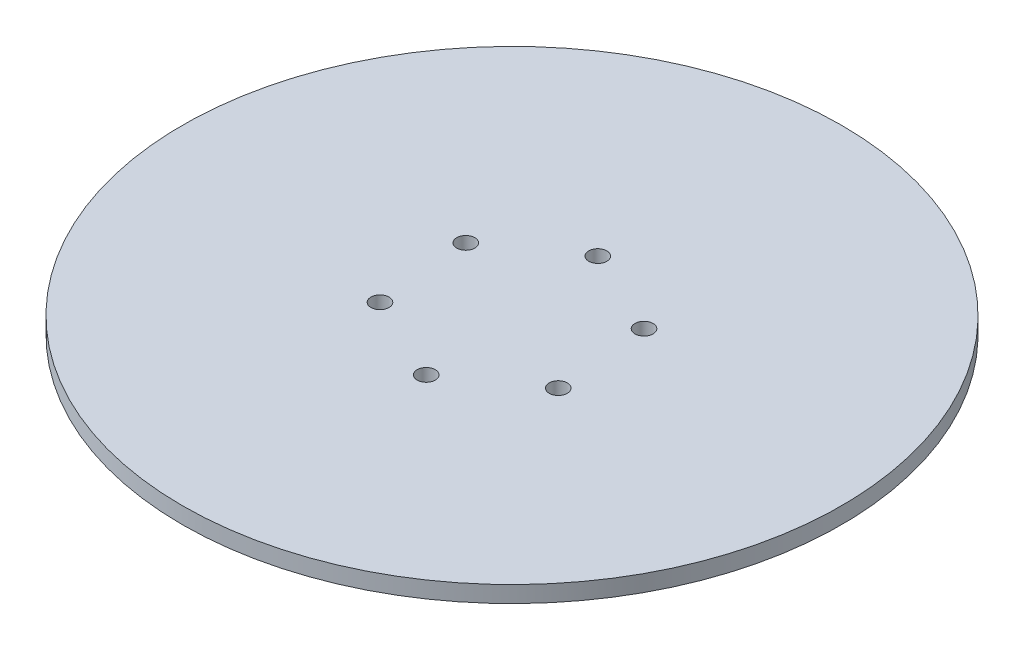
ISO-10303-21;
HEADER;
FILE_DESCRIPTION(('STEP AP214'),'2;1');
FILE_NAME('part.step','',(''),(''),'','','');
FILE_SCHEMA(('AUTOMOTIVE_DESIGN { 1 0 10303 214 1 1 1 1 }'));
ENDSEC;
DATA;
#1=APPLICATION_CONTEXT('core data for automotive mechanical design processes');
#2=APPLICATION_PROTOCOL_DEFINITION('international standard','automotive_design',2000,#1);
#3=PRODUCT_CONTEXT('',#1,'mechanical');
#4=PRODUCT('Part','Part','',(#3));
#5=PRODUCT_RELATED_PRODUCT_CATEGORY('part','',(#4));
#6=PRODUCT_DEFINITION_FORMATION('','',#4);
#7=PRODUCT_DEFINITION_CONTEXT('part definition',#1,'design');
#8=PRODUCT_DEFINITION('design','',#6,#7);
#9=PRODUCT_DEFINITION_SHAPE('','',#8);
#10=(LENGTH_UNIT() NAMED_UNIT(*) SI_UNIT(.MILLI.,.METRE.));
#11=(NAMED_UNIT(*) PLANE_ANGLE_UNIT() SI_UNIT($,.RADIAN.));
#12=(NAMED_UNIT(*) SI_UNIT($,.STERADIAN.) SOLID_ANGLE_UNIT());
#13=UNCERTAINTY_MEASURE_WITH_UNIT(LENGTH_MEASURE(1.E-05),#10,'distance_accuracy_value','');
#14=(GEOMETRIC_REPRESENTATION_CONTEXT(3) GLOBAL_UNCERTAINTY_ASSIGNED_CONTEXT((#13)) GLOBAL_UNIT_ASSIGNED_CONTEXT((#10,
#11,#12)) REPRESENTATION_CONTEXT('',''));
#15=CARTESIAN_POINT('',(0.,0.,0.));
#16=DIRECTION('',(0.,0.,1.));
#17=DIRECTION('',(1.,0.,0.));
#18=AXIS2_PLACEMENT_3D('',#15,#16,#17);
#19=CARTESIAN_POINT('',(0.,3.,0.));
#20=DIRECTION('',(0.,-1.,0.));
#21=DIRECTION('',(0.,0.,-1.));
#22=AXIS2_PLACEMENT_3D('',#19,#20,#21);
#23=CYLINDRICAL_SURFACE('',#22,60.);
#24=CARTESIAN_POINT('',(0.,3.,0.));
#25=DIRECTION('',(0.,1.,0.));
#26=DIRECTION('',(0.,0.,1.));
#27=AXIS2_PLACEMENT_3D('',#24,#25,#26);
#28=CIRCLE('',#27,60.);
#29=CARTESIAN_POINT('',(0.,3.,60.));
#30=VERTEX_POINT('',#29);
#31=EDGE_CURVE('E10',#30,#30,#28,.T.);
#32=ORIENTED_EDGE('',*,*,#31,.F.);
#33=EDGE_LOOP('',(#32));
#34=FACE_BOUND('',#33,.T.);
#35=CARTESIAN_POINT('',(0.,0.,0.));
#36=DIRECTION('',(0.,1.,0.));
#37=DIRECTION('',(0.,0.,1.));
#38=AXIS2_PLACEMENT_3D('',#35,#36,#37);
#39=CIRCLE('',#38,60.);
#40=CARTESIAN_POINT('',(0.,0.,60.));
#41=VERTEX_POINT('',#40);
#42=EDGE_CURVE('E47',#41,#41,#39,.T.);
#43=ORIENTED_EDGE('',*,*,#42,.T.);
#44=EDGE_LOOP('',(#43));
#45=FACE_BOUND('',#44,.T.);
#46=ADVANCED_FACE('F44',(#34,#45),#23,.T.);
#47=CARTESIAN_POINT('',(0.,3.,0.));
#48=DIRECTION('',(0.,1.,0.));
#49=DIRECTION('',(0.,0.,1.));
#50=AXIS2_PLACEMENT_3D('',#47,#48,#49);
#51=PLANE('',#50);
#52=CARTESIAN_POINT('',(1.55746407970775,3.,17.1795461418626));
#53=DIRECTION('',(0.,1.,0.));
#54=DIRECTION('',(0.,0.,1.));
#55=AXIS2_PLACEMENT_3D('',#52,#53,#54);
#56=CIRCLE('',#55,1.64999999999986);
#57=CARTESIAN_POINT('',(1.55746407970775,3.,18.8295461418625));
#58=VERTEX_POINT('',#57);
#59=EDGE_CURVE('E54',#58,#58,#56,.T.);
#60=ORIENTED_EDGE('',*,*,#59,.F.);
#61=EDGE_LOOP('',(#60));
#62=FACE_BOUND('',#61,.T.);
#63=CARTESIAN_POINT('',(-14.0991913444869,3.,9.93857652943925));
#64=DIRECTION('',(0.,1.,0.));
#65=DIRECTION('',(0.,0.,1.));
#66=AXIS2_PLACEMENT_3D('',#63,#64,#65);
#67=CIRCLE('',#66,1.64999999999986);
#68=CARTESIAN_POINT('',(-14.0991913444869,3.,11.5885765294391));
#69=VERTEX_POINT('',#68);
#70=EDGE_CURVE('E58',#69,#69,#67,.T.);
#71=ORIENTED_EDGE('',*,*,#70,.F.);
#72=EDGE_LOOP('',(#71));
#73=FACE_BOUND('',#72,.T.);
#74=CARTESIAN_POINT('',(-15.6566554241948,3.,-7.24096961242457));
#75=DIRECTION('',(0.,1.,0.));
#76=DIRECTION('',(0.,0.,1.));
#77=AXIS2_PLACEMENT_3D('',#74,#75,#76);
#78=CIRCLE('',#77,1.64999999999999);
#79=CARTESIAN_POINT('',(-15.6566554241948,3.,-5.59096961242458));
#80=VERTEX_POINT('',#79);
#81=EDGE_CURVE('E61',#80,#80,#78,.T.);
#82=ORIENTED_EDGE('',*,*,#81,.F.);
#83=EDGE_LOOP('',(#82));
#84=FACE_BOUND('',#83,.T.);
#85=CARTESIAN_POINT('',(-1.55746407970805,3.,-17.1795461418651));
#86=DIRECTION('',(0.,1.,0.));
#87=DIRECTION('',(0.,0.,1.));
#88=AXIS2_PLACEMENT_3D('',#85,#86,#87);
#89=CIRCLE('',#88,1.65000000000001);
#90=CARTESIAN_POINT('',(-1.55746407970805,3.,-15.5295461418651));
#91=VERTEX_POINT('',#90);
#92=EDGE_CURVE('E64',#91,#91,#89,.T.);
#93=ORIENTED_EDGE('',*,*,#92,.F.);
#94=EDGE_LOOP('',(#93));
#95=FACE_BOUND('',#94,.T.);
#96=CARTESIAN_POINT('',(14.0991913444875,3.,-9.93857652944119));
#97=DIRECTION('',(0.,1.,0.));
#98=DIRECTION('',(0.,0.,1.));
#99=AXIS2_PLACEMENT_3D('',#96,#97,#98);
#100=CIRCLE('',#99,1.64999999999986);
#101=CARTESIAN_POINT('',(14.0991913444875,3.,-8.28857652944133));
#102=VERTEX_POINT('',#101);
#103=EDGE_CURVE('E67',#102,#102,#100,.T.);
#104=ORIENTED_EDGE('',*,*,#103,.F.);
#105=EDGE_LOOP('',(#104));
#106=FACE_BOUND('',#105,.T.);
#107=CARTESIAN_POINT('',(15.6566554241945,3.,7.2409696124221));
#108=DIRECTION('',(0.,1.,0.));
#109=DIRECTION('',(0.,0.,1.));
#110=AXIS2_PLACEMENT_3D('',#107,#108,#109);
#111=CIRCLE('',#110,1.64999999999999);
#112=CARTESIAN_POINT('',(15.6566554241945,3.,8.89096961242209));
#113=VERTEX_POINT('',#112);
#114=EDGE_CURVE('E70',#113,#113,#111,.T.);
#115=ORIENTED_EDGE('',*,*,#114,.F.);
#116=EDGE_LOOP('',(#115));
#117=FACE_BOUND('',#116,.T.);
#118=ORIENTED_EDGE('',*,*,#31,.T.);
#119=EDGE_LOOP('',(#118));
#120=FACE_BOUND('',#119,.T.);
#121=ADVANCED_FACE('F98',(#62,#73,#84,#95,#106,#117,#120),#51,.T.);
#122=CARTESIAN_POINT('',(0.,0.,0.));
#123=DIRECTION('',(0.,1.,0.));
#124=DIRECTION('',(0.,0.,1.));
#125=AXIS2_PLACEMENT_3D('',#122,#123,#124);
#126=PLANE('',#125);
#127=CARTESIAN_POINT('',(1.55746407970775,0.,17.1795461418626));
#128=DIRECTION('',(0.,-1.,0.));
#129=DIRECTION('',(0.,0.,-1.));
#130=AXIS2_PLACEMENT_3D('',#127,#128,#129);
#131=CIRCLE('',#130,1.64999999999986);
#132=CARTESIAN_POINT('',(1.55746407970775,0.,15.5295461418628));
#133=VERTEX_POINT('',#132);
#134=EDGE_CURVE('E77',#133,#133,#131,.T.);
#135=ORIENTED_EDGE('',*,*,#134,.F.);
#136=EDGE_LOOP('',(#135));
#137=FACE_BOUND('',#136,.T.);
#138=CARTESIAN_POINT('',(-14.0991913444869,0.,9.93857652943925));
#139=DIRECTION('',(0.,-1.,0.));
#140=DIRECTION('',(0.,0.,-1.));
#141=AXIS2_PLACEMENT_3D('',#138,#139,#140);
#142=CIRCLE('',#141,1.64999999999986);
#143=CARTESIAN_POINT('',(-14.0991913444869,0.,8.28857652943939));
#144=VERTEX_POINT('',#143);
#145=EDGE_CURVE('E80',#144,#144,#142,.T.);
#146=ORIENTED_EDGE('',*,*,#145,.F.);
#147=EDGE_LOOP('',(#146));
#148=FACE_BOUND('',#147,.T.);
#149=CARTESIAN_POINT('',(-15.6566554241948,0.,-7.24096961242457));
#150=DIRECTION('',(0.,-1.,0.));
#151=DIRECTION('',(0.,0.,-1.));
#152=AXIS2_PLACEMENT_3D('',#149,#150,#151);
#153=CIRCLE('',#152,1.64999999999999);
#154=CARTESIAN_POINT('',(-15.6566554241948,0.,-8.89096961242456));
#155=VERTEX_POINT('',#154);
#156=EDGE_CURVE('E83',#155,#155,#153,.T.);
#157=ORIENTED_EDGE('',*,*,#156,.F.);
#158=EDGE_LOOP('',(#157));
#159=FACE_BOUND('',#158,.T.);
#160=CARTESIAN_POINT('',(-1.55746407970805,0.,-17.1795461418651));
#161=DIRECTION('',(0.,-1.,0.));
#162=DIRECTION('',(0.,0.,-1.));
#163=AXIS2_PLACEMENT_3D('',#160,#161,#162);
#164=CIRCLE('',#163,1.65000000000001);
#165=CARTESIAN_POINT('',(-1.55746407970805,0.,-18.8295461418651));
#166=VERTEX_POINT('',#165);
#167=EDGE_CURVE('E86',#166,#166,#164,.T.);
#168=ORIENTED_EDGE('',*,*,#167,.F.);
#169=EDGE_LOOP('',(#168));
#170=FACE_BOUND('',#169,.T.);
#171=CARTESIAN_POINT('',(14.0991913444875,0.,-9.93857652944119));
#172=DIRECTION('',(0.,-1.,0.));
#173=DIRECTION('',(0.,0.,-1.));
#174=AXIS2_PLACEMENT_3D('',#171,#172,#173);
#175=CIRCLE('',#174,1.64999999999986);
#176=CARTESIAN_POINT('',(14.0991913444875,0.,-11.5885765294411));
#177=VERTEX_POINT('',#176);
#178=EDGE_CURVE('E76',#177,#177,#175,.T.);
#179=ORIENTED_EDGE('',*,*,#178,.F.);
#180=EDGE_LOOP('',(#179));
#181=FACE_BOUND('',#180,.T.);
#182=CARTESIAN_POINT('',(15.6566554241945,0.,7.2409696124221));
#183=DIRECTION('',(0.,-1.,0.));
#184=DIRECTION('',(0.,0.,-1.));
#185=AXIS2_PLACEMENT_3D('',#182,#183,#184);
#186=CIRCLE('',#185,1.64999999999999);
#187=CARTESIAN_POINT('',(15.6566554241945,0.,5.59096961242211));
#188=VERTEX_POINT('',#187);
#189=EDGE_CURVE('E73',#188,#188,#186,.T.);
#190=ORIENTED_EDGE('',*,*,#189,.F.);
#191=EDGE_LOOP('',(#190));
#192=FACE_BOUND('',#191,.T.);
#193=ORIENTED_EDGE('',*,*,#42,.F.);
#194=EDGE_LOOP('',(#193));
#195=FACE_BOUND('',#194,.T.);
#196=ADVANCED_FACE('F94',(#137,#148,#159,#170,#181,#192,#195),#126,.F.);
#197=CARTESIAN_POINT('',(15.6566554241945,10.,7.2409696124221));
#198=DIRECTION('',(0.,-1.,0.));
#199=DIRECTION('',(0.,0.,-1.));
#200=AXIS2_PLACEMENT_3D('',#197,#198,#199);
#201=CYLINDRICAL_SURFACE('',#200,1.64999999999999);
#202=ORIENTED_EDGE('',*,*,#114,.T.);
#203=EDGE_LOOP('',(#202));
#204=FACE_BOUND('',#203,.T.);
#205=ORIENTED_EDGE('',*,*,#189,.T.);
#206=EDGE_LOOP('',(#205));
#207=FACE_BOUND('',#206,.T.);
#208=ADVANCED_FACE('F97',(#204,#207),#201,.F.);
#209=CARTESIAN_POINT('',(14.0991913444875,10.,-9.93857652944119));
#210=DIRECTION('',(0.,-1.,0.));
#211=DIRECTION('',(0.,0.,-1.));
#212=AXIS2_PLACEMENT_3D('',#209,#210,#211);
#213=CYLINDRICAL_SURFACE('',#212,1.64999999999986);
#214=ORIENTED_EDGE('',*,*,#103,.T.);
#215=EDGE_LOOP('',(#214));
#216=FACE_BOUND('',#215,.T.);
#217=ORIENTED_EDGE('',*,*,#178,.T.);
#218=EDGE_LOOP('',(#217));
#219=FACE_BOUND('',#218,.T.);
#220=ADVANCED_FACE('F92',(#216,#219),#213,.F.);
#221=CARTESIAN_POINT('',(-1.55746407970805,10.,-17.1795461418651));
#222=DIRECTION('',(0.,-1.,0.));
#223=DIRECTION('',(0.,0.,-1.));
#224=AXIS2_PLACEMENT_3D('',#221,#222,#223);
#225=CYLINDRICAL_SURFACE('',#224,1.65000000000001);
#226=ORIENTED_EDGE('',*,*,#92,.T.);
#227=EDGE_LOOP('',(#226));
#228=FACE_BOUND('',#227,.T.);
#229=ORIENTED_EDGE('',*,*,#167,.T.);
#230=EDGE_LOOP('',(#229));
#231=FACE_BOUND('',#230,.T.);
#232=ADVANCED_FACE('F130',(#228,#231),#225,.F.);
#233=CARTESIAN_POINT('',(-15.6566554241948,10.,-7.24096961242457));
#234=DIRECTION('',(0.,-1.,0.));
#235=DIRECTION('',(0.,0.,-1.));
#236=AXIS2_PLACEMENT_3D('',#233,#234,#235);
#237=CYLINDRICAL_SURFACE('',#236,1.64999999999999);
#238=ORIENTED_EDGE('',*,*,#81,.T.);
#239=EDGE_LOOP('',(#238));
#240=FACE_BOUND('',#239,.T.);
#241=ORIENTED_EDGE('',*,*,#156,.T.);
#242=EDGE_LOOP('',(#241));
#243=FACE_BOUND('',#242,.T.);
#244=ADVANCED_FACE('F126',(#240,#243),#237,.F.);
#245=CARTESIAN_POINT('',(-14.0991913444869,10.,9.93857652943925));
#246=DIRECTION('',(0.,-1.,0.));
#247=DIRECTION('',(0.,0.,-1.));
#248=AXIS2_PLACEMENT_3D('',#245,#246,#247);
#249=CYLINDRICAL_SURFACE('',#248,1.64999999999986);
#250=ORIENTED_EDGE('',*,*,#70,.T.);
#251=EDGE_LOOP('',(#250));
#252=FACE_BOUND('',#251,.T.);
#253=ORIENTED_EDGE('',*,*,#145,.T.);
#254=EDGE_LOOP('',(#253));
#255=FACE_BOUND('',#254,.T.);
#256=ADVANCED_FACE('F122',(#252,#255),#249,.F.);
#257=CARTESIAN_POINT('',(1.55746407970775,10.,17.1795461418626));
#258=DIRECTION('',(0.,-1.,0.));
#259=DIRECTION('',(0.,0.,-1.));
#260=AXIS2_PLACEMENT_3D('',#257,#258,#259);
#261=CYLINDRICAL_SURFACE('',#260,1.64999999999986);
#262=ORIENTED_EDGE('',*,*,#59,.T.);
#263=EDGE_LOOP('',(#262));
#264=FACE_BOUND('',#263,.T.);
#265=ORIENTED_EDGE('',*,*,#134,.T.);
#266=EDGE_LOOP('',(#265));
#267=FACE_BOUND('',#266,.T.);
#268=ADVANCED_FACE('F119',(#264,#267),#261,.F.);
#269=CLOSED_SHELL('',(#46,#121,#196,#208,#220,#232,#244,#256,#268));
#270=MANIFOLD_SOLID_BREP('B2',#269);
#271=ADVANCED_BREP_SHAPE_REPRESENTATION('',(#18,#270),#14);
#272=SHAPE_DEFINITION_REPRESENTATION(#9,#271);
ENDSEC;
END-ISO-10303-21;
